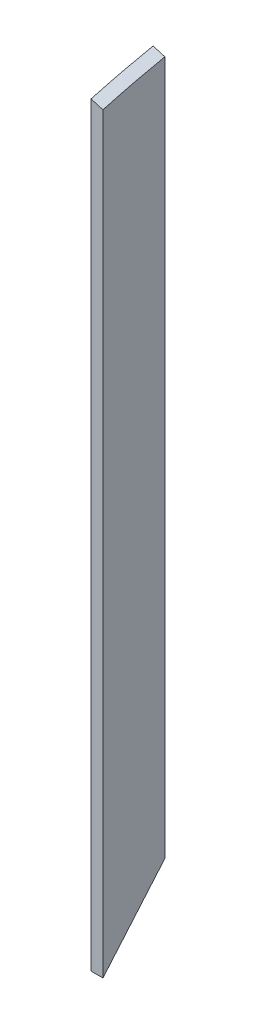
ISO-10303-21;
HEADER;
FILE_DESCRIPTION(('STEP AP214'),'2;1');
FILE_NAME('part.step','',(''),(''),'','','');
FILE_SCHEMA(('AUTOMOTIVE_DESIGN { 1 0 10303 214 1 1 1 1 }'));
ENDSEC;
DATA;
#1=APPLICATION_CONTEXT('core data for automotive mechanical design processes');
#2=APPLICATION_PROTOCOL_DEFINITION('international standard','automotive_design',2000,#1);
#3=PRODUCT_CONTEXT('',#1,'mechanical');
#4=PRODUCT('Part','Part','',(#3));
#5=PRODUCT_RELATED_PRODUCT_CATEGORY('part','',(#4));
#6=PRODUCT_DEFINITION_FORMATION('','',#4);
#7=PRODUCT_DEFINITION_CONTEXT('part definition',#1,'design');
#8=PRODUCT_DEFINITION('design','',#6,#7);
#9=PRODUCT_DEFINITION_SHAPE('','',#8);
#10=(LENGTH_UNIT() NAMED_UNIT(*) SI_UNIT(.MILLI.,.METRE.));
#11=(NAMED_UNIT(*) PLANE_ANGLE_UNIT() SI_UNIT($,.RADIAN.));
#12=(NAMED_UNIT(*) SI_UNIT($,.STERADIAN.) SOLID_ANGLE_UNIT());
#13=UNCERTAINTY_MEASURE_WITH_UNIT(LENGTH_MEASURE(1.E-05),#10,'distance_accuracy_value','');
#14=(GEOMETRIC_REPRESENTATION_CONTEXT(3) GLOBAL_UNCERTAINTY_ASSIGNED_CONTEXT((#13)) GLOBAL_UNIT_ASSIGNED_CONTEXT((#10,
#11,#12)) REPRESENTATION_CONTEXT('',''));
#15=CARTESIAN_POINT('',(0.,0.,0.));
#16=DIRECTION('',(0.,0.,1.));
#17=DIRECTION('',(1.,0.,0.));
#18=AXIS2_PLACEMENT_3D('',#15,#16,#17);
#19=CARTESIAN_POINT('',(114.922721068152,110.654023481096,18.6636491961611));
#20=CARTESIAN_POINT('',(114.919502655417,111.325435038433,17.5793740563256));
#21=CARTESIAN_POINT('',(114.912647130221,112.567930828725,15.3820902940956));
#22=CARTESIAN_POINT('',(114.904072156595,114.114718488642,12.0907167514568));
#23=CARTESIAN_POINT('',(114.899760858364,115.315705283254,8.88422166455286));
#24=CARTESIAN_POINT('',(114.904772036529,116.456706466605,4.80386427139214));
#25=CARTESIAN_POINT('',(114.926037269445,116.823900728959,2.05006306522136));
#26=CARTESIAN_POINT('',(114.953225925957,116.94235421813,0.414110401426249));
#27=CARTESIAN_POINT('',(115.225751413496,110.653984163291,18.6634138121703));
#28=CARTESIAN_POINT('',(115.220652416992,111.325381616022,17.5792154912705));
#29=CARTESIAN_POINT('',(115.209982821501,112.567294272047,15.3814728773825));
#30=CARTESIAN_POINT('',(115.196247760789,114.112844238994,12.0890485996327));
#31=CARTESIAN_POINT('',(115.187991312897,115.313584239619,8.88245363851667));
#32=CARTESIAN_POINT('',(115.190142555533,116.455227024998,4.80273283147372));
#33=CARTESIAN_POINT('',(115.212609250824,116.823594241705,2.04980144404081));
#34=CARTESIAN_POINT('',(115.242264990126,116.942356031957,0.414110002792164));
#35=CARTESIAN_POINT('',(115.830653981397,110.649256729008,18.6581194765323));
#36=CARTESIAN_POINT('',(115.821959141385,111.320352813837,17.5742278072858));
#37=CARTESIAN_POINT('',(115.803847585746,112.560636953868,15.3760282542018));
#38=CARTESIAN_POINT('',(115.779895440134,114.103291557525,12.082431180946));
#39=CARTESIAN_POINT('',(115.763901015008,115.3034725391,8.87674677885018));
#40=CARTESIAN_POINT('',(115.760555841199,116.446568591924,4.79967553848202));
#41=CARTESIAN_POINT('',(115.785576167897,116.817345786532,2.04905422532069));
#42=CARTESIAN_POINT('',(115.820245156084,116.936837401941,0.414204277524026));
#43=CARTESIAN_POINT('',(116.743568346008,110.6278778152,18.6353544123418));
#44=CARTESIAN_POINT('',(116.729216498517,111.298061200236,17.552814435961));
#45=CARTESIAN_POINT('',(116.699189353104,112.535138488739,15.3560085805786));
#46=CARTESIAN_POINT('',(116.658561840845,114.072628950438,12.0638101938352));
#47=CARTESIAN_POINT('',(116.629769639079,115.271433004687,8.86236896257952));
#48=CARTESIAN_POINT('',(116.616660148035,116.416440380312,4.79260122883147));
#49=CARTESIAN_POINT('',(116.644306390072,116.791097390367,2.04725432012016));
#50=CARTESIAN_POINT('',(116.68557075427,116.912060694288,0.414635967144779));
#51=CARTESIAN_POINT('',(117.64285119449,110.592697363985,18.598310150078));
#52=CARTESIAN_POINT('',(117.6237655248,111.261497340516,17.5179946805126));
#53=CARTESIAN_POINT('',(117.583398077587,112.494651292746,15.3246845377376));
#54=CARTESIAN_POINT('',(117.528037146246,114.02623472504,12.0370721826068));
#55=CARTESIAN_POINT('',(117.488319270492,115.222990073713,8.84256433934267));
#56=CARTESIAN_POINT('',(117.467751468814,116.369357429443,4.78312737107974));
#57=CARTESIAN_POINT('',(117.499480110829,116.748085006081,2.04481543128824));
#58=CARTESIAN_POINT('',(117.548159368522,116.870844837522,0.415362960436575));
#59=CARTESIAN_POINT('',(118.543973933552,110.543225730251,18.5465120004037));
#60=CARTESIAN_POINT('',(118.519982844402,111.210131388518,17.4692554100843));
#61=CARTESIAN_POINT('',(118.468790059746,112.438634923086,15.2815347570807));
#62=CARTESIAN_POINT('',(118.397804830218,113.963676404405,12.0018123209999));
#63=CARTESIAN_POINT('',(118.346318520619,115.157860641402,8.8170739975301));
#64=CARTESIAN_POINT('',(118.317089160155,116.305238089574,4.77117184766666));
#65=CARTESIAN_POINT('',(118.35177160135,116.688306528184,2.04170914360372));
#66=CARTESIAN_POINT('',(118.406902120137,116.813236407478,0.416390371403476));
#67=CARTESIAN_POINT('',(119.44277615242,110.479173108781,18.4797269812068));
#68=CARTESIAN_POINT('',(119.41389639041,111.143711367014,17.4064137879403));
#69=CARTESIAN_POINT('',(119.351802639073,112.366878720667,15.2264071592544));
#70=CARTESIAN_POINT('',(119.264928970987,113.884772769934,11.9578810194055));
#71=CARTESIAN_POINT('',(119.201401398495,115.075923838074,8.78578681757699));
#72=CARTESIAN_POINT('',(119.162971368509,116.22405272723,4.75668885008777));
#73=CARTESIAN_POINT('',(119.19985968635,116.61177512989,2.0379208629042));
#74=CARTESIAN_POINT('',(119.260692638214,116.739272936473,0.417723133967515));
#75=CARTESIAN_POINT('',(120.326205378249,110.401554350642,18.3990921743292));
#76=CARTESIAN_POINT('',(120.293179803749,111.063191100802,17.3305352223659));
#77=CARTESIAN_POINT('',(120.221603723504,112.280219057438,15.1601850803052));
#78=CARTESIAN_POINT('',(120.120790535692,113.790201982083,11.9059182726791));
#79=CARTESIAN_POINT('',(120.047016974189,114.977706813779,8.74913707393806));
#80=CARTESIAN_POINT('',(120.001420922015,116.126119280415,4.73988285825633));
#81=CARTESIAN_POINT('',(120.041522898656,116.518631654667,2.03352437892435));
#82=CARTESIAN_POINT('',(120.108453620281,116.648977366015,0.419366863196329));
#83=CARTESIAN_POINT('',(121.207772981753,110.309521585924,18.3038087322582));
#84=CARTESIAN_POINT('',(121.17039960314,110.967797942276,17.2409225707271));
#85=CARTESIAN_POINT('',(121.088965915609,112.178003361507,15.0823020141401));
#86=CARTESIAN_POINT('',(120.973670428435,113.679453073722,11.8454913591045));
#87=CARTESIAN_POINT('',(120.889055659749,114.862841162806,8.70681703054935));
#88=CARTESIAN_POINT('',(120.835231171218,116.011254383707,4.72060061542824));
#89=CARTESIAN_POINT('',(120.87726481726,116.408820577333,2.02846659520302));
#90=CARTESIAN_POINT('',(120.949114647416,116.542371603069,0.421324777720173));
#91=CARTESIAN_POINT('',(122.07894086088,110.204028625176,18.1949688212601));
#92=CARTESIAN_POINT('',(122.037481832258,110.858443061155,17.1386204037375));
#93=CARTESIAN_POINT('',(121.946766431347,112.061040963344,14.9936401230406));
#94=CARTESIAN_POINT('',(121.81784552706,113.553171521489,11.7772381165898));
#95=CARTESIAN_POINT('',(121.723096109869,114.731815141033,8.65925610237083));
#96=CARTESIAN_POINT('',(121.661589325732,115.879729907726,4.6990419832429));
#97=CARTESIAN_POINT('',(121.705354058666,116.282436005261,2.02282379148673));
#98=CARTESIAN_POINT('',(121.781643784019,116.419430530347,0.423609119845726));
#99=CARTESIAN_POINT('',(122.940043421039,110.085535649444,18.073151263622));
#100=CARTESIAN_POINT('',(122.894664787672,110.73558637962,17.0242019606626));
#101=CARTESIAN_POINT('',(122.795087582583,111.929768012383,14.8946796133261));
#102=CARTESIAN_POINT('',(122.6532079116,113.411738153575,11.7014913192463));
#103=CARTESIAN_POINT('',(122.548826854435,114.584956276931,8.60666228611148));
#104=CARTESIAN_POINT('',(122.479883405771,115.73179062176,4.67528323486592));
#105=CARTESIAN_POINT('',(122.524907622142,116.139638653058,2.0166065359517));
#106=CARTESIAN_POINT('',(122.604953229161,116.280253549222,0.426198551981068));
#107=CARTESIAN_POINT('',(123.789706686758,109.954626157281,17.9390734815831));
#108=CARTESIAN_POINT('',(123.740614593405,110.599833140044,16.8983334521208));
#109=CARTESIAN_POINT('',(123.632710264196,111.78483693672,14.7859398762785));
#110=CARTESIAN_POINT('',(123.478740856593,113.255888739361,11.6185989634062));
#111=CARTESIAN_POINT('',(123.365402362585,114.4230639463,8.54922835909024));
#112=CARTESIAN_POINT('',(123.289456034808,115.568280158633,4.64934556249179));
#113=CARTESIAN_POINT('',(123.335366918755,115.981252728008,2.00974679959702));
#114=CARTESIAN_POINT('',(123.418540332784,116.125636003205,0.428982253767693));
#115=CARTESIAN_POINT('',(124.629644510649,109.811207491047,17.7927837938395));
#116=CARTESIAN_POINT('',(124.576882455315,110.451109501508,16.7610853961534));
#117=CARTESIAN_POINT('',(124.46089012816,111.626199009023,14.6674831804084));
#118=CARTESIAN_POINT('',(124.295294900925,113.085606634865,11.5286154492367));
#119=CARTESIAN_POINT('',(124.173260685051,114.246151328209,8.48700170732796));
#120=CARTESIAN_POINT('',(124.090179671904,115.389240272858,4.62127902298393));
#121=CARTESIAN_POINT('',(124.136153876362,115.807322999511,2.00230583878759));
#122=CARTESIAN_POINT('',(124.221511623704,115.955617266535,0.432029577240527));
#123=CARTESIAN_POINT('',(125.455109245557,109.656464589371,17.6356378059314));
#124=CARTESIAN_POINT('',(125.398971548514,110.29055773091,16.6137285530749));
#125=CARTESIAN_POINT('',(125.275636012858,111.454897129007,14.540374746647));
#126=CARTESIAN_POINT('',(125.099613095932,112.901778019777,11.4323195303875));
#127=CARTESIAN_POINT('',(124.969829513425,114.054950922445,8.42051300984939));
#128=CARTESIAN_POINT('',(124.880340425408,115.195184831965,4.59134047533096));
#129=CARTESIAN_POINT('',(124.926153789198,115.618172010654,1.99439020712139));
#130=CARTESIAN_POINT('',(125.013151787918,115.770387109237,0.435368799819775));
#131=CARTESIAN_POINT('',(126.269619822428,109.489981588804,17.467375066845));
#132=CARTESIAN_POINT('',(126.210143498767,110.117808667357,16.4560290313831));
#133=CARTESIAN_POINT('',(126.07971324473,111.270644566807,14.4044187744586));
#134=CARTESIAN_POINT('',(125.893746898328,112.704227142795,11.3295645242465));
#135=CARTESIAN_POINT('',(125.756453027758,113.849390193196,8.34966011767521));
#136=CARTESIAN_POINT('',(125.660346211041,114.986162058646,4.55949051009256));
#137=CARTESIAN_POINT('',(125.705072662837,115.413914969673,1.98600946816327));
#138=CARTESIAN_POINT('',(125.792693092461,115.57009419741,0.439038937026957));
#139=CARTESIAN_POINT('',(127.068621906014,109.31308181563,17.2894917224386));
#140=CARTESIAN_POINT('',(127.006086317256,109.934128723429,16.2893687572323));
#141=CARTESIAN_POINT('',(126.869285367868,111.074587378596,14.2607813375011));
#142=CARTESIAN_POINT('',(126.674536683175,112.493912839182,11.2212044004219));
#143=CARTESIAN_POINT('',(126.530609335982,113.63024479076,8.27502981555207));
#144=CARTESIAN_POINT('',(126.428489822561,114.762690020968,4.52601784198696));
#145=CARTESIAN_POINT('',(126.471794152142,115.194849546568,1.9772870466317));
#146=CARTESIAN_POINT('',(126.559423084959,115.354884375843,0.443076896012916));
#147=CARTESIAN_POINT('',(127.859412297571,109.124328402743,17.1007162929509));
#148=CARTESIAN_POINT('',(127.793624032428,109.738181953476,16.1125580600829));
#149=CARTESIAN_POINT('',(127.650249824231,110.865591212205,14.1084662172202));
#150=CARTESIAN_POINT('',(127.446529884804,112.269991229348,11.1064984895475));
#151=CARTESIAN_POINT('',(127.295515906758,113.396945458431,8.1961104614033));
#152=CARTESIAN_POINT('',(127.186240293364,114.524543402038,4.49068470864533));
#153=CARTESIAN_POINT('',(127.226494231787,114.960983196968,1.96815981345401));
#154=CARTESIAN_POINT('',(127.312653737525,115.124904535825,0.447517744950626));
#155=CARTESIAN_POINT('',(128.634553295224,108.925589635486,16.9030875264351));
#156=CARTESIAN_POINT('',(128.565738665707,109.53174161876,15.9274657964116));
#157=CARTESIAN_POINT('',(128.416403496808,110.645241419426,13.949062530336));
#158=CARTESIAN_POINT('',(128.204680392061,112.033759241662,10.9866086102302));
#159=CARTESIAN_POINT('',(128.047232738218,113.150510845407,8.11370467123515));
#160=CARTESIAN_POINT('',(127.931091637767,114.272358629483,4.45388700044103));
#161=CARTESIAN_POINT('',(127.967729515364,114.712637972987,1.95879401405366));
#162=CARTESIAN_POINT('',(128.051672451863,114.88026417015,0.452406294406413));
#163=CARTESIAN_POINT('',(129.395500326068,108.716864068897,16.69674578504));
#164=CARTESIAN_POINT('',(129.323772889153,109.314817363053,15.7341871277748));
#165=CARTESIAN_POINT('',(129.168862270846,110.413589745668,13.7826606225426));
#166=CARTESIAN_POINT('',(128.949762059408,111.78533555205,10.861587728903));
#167=CARTESIAN_POINT('',(128.786190174837,112.891115691681,8.02784302100585));
#168=CARTESIAN_POINT('',(128.663028823268,114.006360554095,4.41563203273844));
#169=CARTESIAN_POINT('',(128.695176315306,114.450045878421,1.94919504594197));
#170=CARTESIAN_POINT('',(128.775965568022,114.621188055638,0.45775054528022));
#171=CARTESIAN_POINT('',(130.146418017836,108.496878025111,16.4806015524361));
#172=CARTESIAN_POINT('',(130.071589339048,109.086169498983,15.5317305234433));
#173=CARTESIAN_POINT('',(129.910862214388,110.169455592139,13.6085284459086));
#174=CARTESIAN_POINT('',(129.684037119934,111.523589342433,10.7309553591927));
#175=CARTESIAN_POINT('',(129.513672147651,112.61769497608,7.93829403478979));
#176=CARTESIAN_POINT('',(129.382031291954,113.725586602181,4.37598493730472));
#177=CARTESIAN_POINT('',(129.407838780257,114.17233520483,1.93961524440706));
#178=CARTESIAN_POINT('',(129.48388934463,114.346862284779,0.463903392110953));
#179=CARTESIAN_POINT('',(130.878555666009,108.268264902668,16.2573841288218));
#180=CARTESIAN_POINT('',(130.80091485168,108.848293920759,15.3226103583183));
#181=CARTESIAN_POINT('',(130.635038825038,109.915053592941,13.4288008486226));
#182=CARTESIAN_POINT('',(130.401425079221,111.250286988662,10.5962462090754));
#183=CARTESIAN_POINT('',(130.224860233428,112.331581533145,7.84608733516594));
#184=CARTESIAN_POINT('',(130.084964686778,113.430782620677,4.3353978346907));
#185=CARTESIAN_POINT('',(130.103880744547,113.879786055035,1.93017779238235));
#186=CARTESIAN_POINT('',(130.174510468417,114.057256445411,0.470813887746122));
#187=CARTESIAN_POINT('',(131.598444293574,108.028978937581,16.0252342983254));
#188=CARTESIAN_POINT('',(131.517860095798,108.599268475534,15.1051183191854));
#189=CARTESIAN_POINT('',(131.346654440296,109.648699559826,13.242032887492));
#190=CARTESIAN_POINT('',(131.105907961372,110.964086553318,10.4563830330197));
#191=CARTESIAN_POINT('',(130.922459503349,112.031760034745,7.7504742075413));
#192=CARTESIAN_POINT('',(130.772847270869,113.121349597723,4.2935177212104));
#193=CARTESIAN_POINT('',(130.783080220504,113.572090159283,1.92078115936628));
#194=CARTESIAN_POINT('',(130.846792951935,113.752239977936,0.478522930952146));
#195=CARTESIAN_POINT('',(132.297517433767,107.78195985391,15.7871163303848));
#196=CARTESIAN_POINT('',(132.214307681907,108.341873083794,14.8820039005234));
#197=CARTESIAN_POINT('',(132.0384532925,109.372846058504,13.0505050034375));
#198=CARTESIAN_POINT('',(131.791472382426,110.666952098898,10.3130038236447));
#199=CARTESIAN_POINT('',(131.601702133249,111.719714949332,7.65253112871263));
#200=CARTESIAN_POINT('',(131.442604035632,112.798120028442,4.25077749976452));
#201=CARTESIAN_POINT('',(131.44369623677,113.249559637443,1.91148379624603));
#202=CARTESIAN_POINT('',(131.499930327777,113.431778178463,0.486890881723489));
#203=CARTESIAN_POINT('',(132.99059276561,107.521546993657,15.5377178258851));
#204=CARTESIAN_POINT('',(132.904140286646,108.070725493788,14.648425253996));
#205=CARTESIAN_POINT('',(132.722475857373,109.082683689149,12.8502353416741));
#206=CARTESIAN_POINT('',(132.467418363881,110.35497021664,10.1633827458578));
#207=CARTESIAN_POINT('',(132.26911409651,111.392402300535,7.55063141890503));
#208=CARTESIAN_POINT('',(132.097027338088,112.459199891425,4.20683753377783));
#209=CARTESIAN_POINT('',(132.085688240065,112.911166006078,1.90271885477966));
#210=CARTESIAN_POINT('',(132.131984392193,113.095394892329,0.496768522191731));
#211=CARTESIAN_POINT('',(133.662046624192,107.25314180938,15.2823595673198));
#212=CARTESIAN_POINT('',(133.57257418488,107.790975732426,14.409304079964));
#213=CARTESIAN_POINT('',(133.385544330352,108.78281066769,12.6452515208837));
#214=CARTESIAN_POINT('',(133.122891288391,110.031867375892,10.0102906093209));
#215=CARTESIAN_POINT('',(132.916199484356,111.052695791702,7.44645244670917));
#216=CARTESIAN_POINT('',(132.730842104893,112.106308251516,4.16212482902499));
#217=CARTESIAN_POINT('',(132.706311499867,112.557710013587,1.89418570950117));
#218=CARTESIAN_POINT('',(132.741965265209,112.743283690859,0.507473060023241));
#219=CARTESIAN_POINT('',(134.321274964512,106.972704046047,15.0173361468944));
#220=CARTESIAN_POINT('',(134.228504604416,107.49876699236,14.1611258351854));
#221=CARTESIAN_POINT('',(134.03557646125,108.469764553328,12.4324547567377));
#222=CARTESIAN_POINT('',(133.764375050526,109.694792744114,9.85124733693011));
#223=CARTESIAN_POINT('',(133.548000944943,110.698317824676,7.33807081248547));
#224=CARTESIAN_POINT('',(133.347174672583,111.737891077402,4.11538387190067));
#225=CARTESIAN_POINT('',(133.307272727119,112.188143946194,1.88505747882715));
#226=CARTESIAN_POINT('',(133.330648943629,112.374715590632,0.518429568312062));
#227=CARTESIAN_POINT('',(134.964529929712,106.680786484559,14.743363131104));
#228=CARTESIAN_POINT('',(134.868080078999,107.194781919786,13.9044695794637));
#229=CARTESIAN_POINT('',(134.668511576225,108.144506169287,12.2121798341504));
#230=CARTESIAN_POINT('',(134.387501672075,109.345128909118,9.68629181327502));
#231=CARTESIAN_POINT('',(134.159856116883,110.3310213849,7.22527061168337));
#232=CARTESIAN_POINT('',(133.94100944408,111.356108457206,4.06611513957652));
#233=CARTESIAN_POINT('',(133.883355067624,111.804822533084,1.8746870892069));
#234=CARTESIAN_POINT('',(133.892730401772,111.992138058777,0.528927294128911));
#235=CARTESIAN_POINT('',(135.590321155591,106.377513073349,14.4607214171458));
#236=CARTESIAN_POINT('',(135.490414422165,106.878883376637,13.6395555598158));
#237=CARTESIAN_POINT('',(135.284721478636,107.806388209148,11.9845248767602));
#238=CARTESIAN_POINT('',(134.994625855159,108.981499239338,9.51535786051882));
#239=CARTESIAN_POINT('',(134.756133983435,109.948739202618,7.10785867718509));
#240=CARTESIAN_POINT('',(134.519452944097,110.958019268447,4.01399448351732));
#241=CARTESIAN_POINT('',(134.443784305364,111.404198773331,1.8626862622144));
#242=CARTESIAN_POINT('',(134.438883319494,111.591630129016,0.538553147784656));
#243=CARTESIAN_POINT('',(136.201072869893,106.062113799319,14.1688506796861));
#244=CARTESIAN_POINT('',(136.097408224996,106.550843556961,13.3658187733114));
#245=CARTESIAN_POINT('',(135.885126134239,107.456281551119,11.7489417215514));
#246=CARTESIAN_POINT('',(135.585303349923,108.606392780779,9.33796006776094));
#247=CARTESIAN_POINT('',(135.335030695136,109.555469126973,6.98540856481879));
#248=CARTESIAN_POINT('',(135.07891411571,110.54946518067,3.95867125584219));
#249=CARTESIAN_POINT('',(134.983674844251,110.993285325136,1.84876124028406));
#250=CARTESIAN_POINT('',(134.963402824076,111.180890372069,0.547054066784876));
#251=CARTESIAN_POINT('',(136.795981566049,105.735727006808,13.8689526670047));
#252=CARTESIAN_POINT('',(136.68853113301,106.211533482772,13.0843247727708));
#253=CARTESIAN_POINT('',(136.469832698208,107.094608045909,11.5062838853481));
#254=CARTESIAN_POINT('',(136.160752064342,108.219686058577,9.15473024578717));
#255=CARTESIAN_POINT('',(135.898894652042,109.150544683357,6.85834309117793));
#256=CARTESIAN_POINT('',(135.62328770021,110.129066698476,3.90031417379758));
#257=CARTESIAN_POINT('',(135.508134889934,110.570192163268,1.83292787725972));
#258=CARTESIAN_POINT('',(135.472232682135,110.757707715894,0.554365910631871));
#259=CARTESIAN_POINT('',(137.376475709813,105.398879283185,13.5616349357755));
#260=CARTESIAN_POINT('',(137.265240106046,105.861805765407,12.7957024504186));
#261=CARTESIAN_POINT('',(137.040219524481,106.722731056377,11.2571027036347));
#262=CARTESIAN_POINT('',(136.722092368611,107.823303023776,8.96596673455842));
#263=CARTESIAN_POINT('',(136.448695650222,108.736464185495,6.72678437563267));
#264=CARTESIAN_POINT('',(136.153445698335,109.700055825692,3.83887494245544));
#265=CARTESIAN_POINT('',(136.018032325504,110.13860686143,1.81504430978161));
#266=CARTESIAN_POINT('',(135.966268879561,110.326030683682,0.560301701386338));
#267=CARTESIAN_POINT('',(137.943492189676,105.052325452275,13.2477022615364));
#268=CARTESIAN_POINT('',(137.828042511068,105.501823303219,12.5004495255258));
#269=CARTESIAN_POINT('',(137.596443561441,106.340085979492,11.001640680566));
#270=CARTESIAN_POINT('',(137.26964289331,107.416206620909,8.77199121845407));
#271=CARTESIAN_POINT('',(136.984749971993,108.311585582963,6.59100449215521));
#272=CARTESIAN_POINT('',(136.669589487168,109.259901846825,3.77447868314897));
#273=CARTESIAN_POINT('',(136.513468779642,109.695354553877,1.79513201510913));
#274=CARTESIAN_POINT('',(136.445560522693,109.88228306411,0.564827985468215));
#275=CARTESIAN_POINT('',(138.497590620821,104.697360877596,12.9284286147097));
#276=CARTESIAN_POINT('',(138.379010360602,105.134005483409,12.200125369544));
#277=CARTESIAN_POINT('',(138.142904614327,105.950669793942,10.7414867252566));
#278=CARTESIAN_POINT('',(137.810469074269,107.003819906137,8.57376973887872));
#279=CARTESIAN_POINT('',(137.517197643077,107.882892771808,6.45159691430676));
#280=CARTESIAN_POINT('',(137.186320515775,108.817694367707,3.70741512481369));
#281=CARTESIAN_POINT('',(137.012598876399,109.250946365833,1.77332474446836));
#282=CARTESIAN_POINT('',(136.930669122604,109.437827144585,0.56799289009607));
#283=CARTESIAN_POINT('',(139.038106789727,104.336408165097,12.6060470013651));
#284=CARTESIAN_POINT('',(138.913144530265,104.758522182388,11.8966042903692));
#285=CARTESIAN_POINT('',(138.666349023497,105.5506881697,10.478132745835));
#286=CARTESIAN_POINT('',(138.319323002811,106.577262636271,8.37264422902514));
#287=CARTESIAN_POINT('',(138.008341005593,107.436534226044,6.30962530683556));
#288=CARTESIAN_POINT('',(137.648916527838,108.353218148826,3.63831100026925));
#289=CARTESIAN_POINT('',(137.447643875401,108.780826833156,1.74995111045068));
#290=CARTESIAN_POINT('',(137.345080406902,108.965447148644,0.569963574176255));
#291=CARTESIAN_POINT('',(139.395038614064,104.089198865665,12.3868019168595));
#292=CARTESIAN_POINT('',(139.271248113416,104.502773469585,11.6881885657459));
#293=CARTESIAN_POINT('',(139.032285356481,105.284147764207,10.2956751941966));
#294=CARTESIAN_POINT('',(138.703896442351,106.305375571814,8.23395625720348));
#295=CARTESIAN_POINT('',(138.408800985779,107.162113525745,6.2117846000377));
#296=CARTESIAN_POINT('',(138.06685424745,108.079117653681,3.5902483713719));
#297=CARTESIAN_POINT('',(137.874673961694,108.510771981469,1.7330387547634));
#298=CARTESIAN_POINT('',(137.776795429263,108.698572758265,0.570370654680235));
#299=CARTESIAN_POINT('',(139.571670484226,103.964903039145,12.2769599484237));
#300=CARTESIAN_POINT('',(139.443778795275,104.373667783412,11.5858850803895));
#301=CARTESIAN_POINT('',(139.19490237974,105.14503711497,10.2075713864124));
#302=CARTESIAN_POINT('',(138.848809312042,106.152275143037,8.16569050873052));
#303=CARTESIAN_POINT('',(138.535567082904,106.998283649001,6.16305250764429));
#304=CARTESIAN_POINT('',(138.168152387982,107.904577385449,3.56608958023977));
#305=CARTESIAN_POINT('',(137.954760674036,108.331207402007,1.72446307812241));
#306=CARTESIAN_POINT('',(137.841972434764,108.516293145386,0.570498319945944));
#307=(BOUNDED_SURFACE() B_SPLINE_SURFACE(3,3,((#19,#20,#21,#22,#23,#24,#25,#26),(#27,#28,#29,
#30,#31,#32,#33,#34),(#35,#36,#37,#38,#39,#40,#41,#42),(#43,#44,#45,#46,#47,#48,#49,#50),(#51,
#52,#53,#54,#55,#56,#57,#58),(#59,#60,#61,#62,#63,#64,#65,#66),(#67,#68,#69,#70,#71,#72,#73,
#74),(#75,#76,#77,#78,#79,#80,#81,#82),(#83,#84,#85,#86,#87,#88,#89,#90),(#91,#92,#93,#94,#95,
#96,#97,#98),(#99,#100,#101,#102,#103,#104,#105,#106),(#107,#108,#109,#110,#111,#112,#113,#114),
(#115,#116,#117,#118,#119,#120,#121,#122),(#123,#124,#125,#126,#127,#128,#129,#130),(#131,#132,
#133,#134,#135,#136,#137,#138),(#139,#140,#141,#142,#143,#144,#145,#146),(#147,#148,#149,#150,
#151,#152,#153,#154),(#155,#156,#157,#158,#159,#160,#161,#162),(#163,#164,#165,#166,#167,#168,
#169,#170),(#171,#172,#173,#174,#175,#176,#177,#178),(#179,#180,#181,#182,#183,#184,#185,#186),
(#187,#188,#189,#190,#191,#192,#193,#194),(#195,#196,#197,#198,#199,#200,#201,#202),(#203,#204,
#205,#206,#207,#208,#209,#210),(#211,#212,#213,#214,#215,#216,#217,#218),(#219,#220,#221,#222,
#223,#224,#225,#226),(#227,#228,#229,#230,#231,#232,#233,#234),(#235,#236,#237,#238,#239,#240,
#241,#242),(#243,#244,#245,#246,#247,#248,#249,#250),(#251,#252,#253,#254,#255,#256,#257,#258),
(#259,#260,#261,#262,#263,#264,#265,#266),(#267,#268,#269,#270,#271,#272,#273,#274),(#275,#276,
#277,#278,#279,#280,#281,#282),(#283,#284,#285,#286,#287,#288,#289,#290),(#291,#292,#293,#294,
#295,#296,#297,#298),(#299,#300,#301,#302,#303,#304,#305,#306)),.UNSPECIFIED.,.F.,.F.,
.F.) B_SPLINE_SURFACE_WITH_KNOTS((4,1,1,1,1,1,1,1,1,1,1,1,1,1,1,1,1,1,1,1,1,1,1,1,1,1,1,1,1,1,1,
1,1,4),(4,1,1,1,1,4),(0.,0.891757915098714,1.78351583019743,2.67527374529614,3.56703166039486,
4.45878957549357,5.35054749059228,6.242305405691,7.13406332078971,8.02582123588842,
8.91757915098714,9.80933706608585,10.7010949811846,11.5928528962833,12.484610811382,
13.3763687264807,14.2681266415794,15.1598845566781,16.0516424717768,16.9434003868756,
17.8351583019743,18.726916217073,19.6186741321717,20.5104320472704,21.4021899623691,
22.2939478774678,23.1857057925666,24.0774637076653,24.969221622764,25.8609795378627,
26.7527374529614,27.6444953680601,28.5362532831588,29.4280111982576),(0.,4.13874153545401,
8.27748307090802,12.416224606362,16.554966141816,24.8324492127241),
.UNSPECIFIED.) GEOMETRIC_REPRESENTATION_ITEM() RATIONAL_B_SPLINE_SURFACE(((1.,1.,1.,1.,1.,1.,1.,
1.),(1.,1.,1.,1.,1.,1.,1.,1.),(1.,1.,1.,1.,1.,1.,1.,1.),(1.,1.,1.,1.,1.,1.,1.,1.),(1.,1.,1.,1.,
1.,1.,1.,1.),(1.,1.,1.,1.,1.,1.,1.,1.),(1.,1.,1.,1.,1.,1.,1.,1.),(1.,1.,1.,1.,1.,1.,1.,1.),(1.,
1.,1.,1.,1.,1.,1.,1.),(1.,1.,1.,1.,1.,1.,1.,1.),(1.,1.,1.,1.,1.,1.,1.,1.),(1.,1.,1.,1.,1.,1.,1.,
1.),(1.,1.,1.,1.,1.,1.,1.,1.),(1.,1.,1.,1.,1.,1.,1.,1.),(1.,1.,1.,1.,1.,1.,1.,1.),(1.,1.,1.,1.,
1.,1.,1.,1.),(1.,1.,1.,1.,1.,1.,1.,1.),(1.,1.,1.,1.,1.,1.,1.,1.),(1.,1.,1.,1.,1.,1.,1.,1.),(1.,
1.,1.,1.,1.,1.,1.,1.),(1.,1.,1.,1.,1.,1.,1.,1.),(1.,1.,1.,1.,1.,1.,1.,1.),(1.,1.,1.,1.,1.,1.,1.,
1.),(1.,1.,1.,1.,1.,1.,1.,1.),(1.,1.,1.,1.,1.,1.,1.,1.),(1.,1.,1.,1.,1.,1.,1.,1.),(1.,1.,1.,1.,
1.,1.,1.,1.),(1.,1.,1.,1.,1.,1.,1.,1.),(1.,1.,1.,1.,1.,1.,1.,1.),(1.,1.,1.,1.,1.,1.,1.,1.),(1.,
1.,1.,1.,1.,1.,1.,1.),(1.,1.,1.,1.,1.,1.,1.,1.),(1.,1.,1.,1.,1.,1.,1.,1.),(1.,1.,1.,1.,1.,1.,1.,
1.),(1.,1.,1.,1.,1.,1.,1.,1.),(1.,1.,1.,1.,1.,1.,1.,1.))) REPRESENTATION_ITEM('') SURFACE());
#308=CARTESIAN_POINT('',(125.611863852919,115.110802996581,3.62988005976674));
#309=CARTESIAN_POINT('',(125.611863852919,115.019493831563,4.08337130174199));
#310=CARTESIAN_POINT('',(125.61186385292,114.920046122763,4.53523642503494));
#311=CARTESIAN_POINT('',(125.61186385292,114.704770499934,5.43631383116329));
#312=CARTESIAN_POINT('',(125.611863852919,114.589492138581,5.88290895854391));
#313=CARTESIAN_POINT('',(125.611863852919,114.46617489504,6.32878808187529));
#314=(BOUNDED_CURVE() B_SPLINE_CURVE(3,(#308,#309,#310,#311,#312,#313),.UNSPECIFIED.,.F.,
.F.) B_SPLINE_CURVE_WITH_KNOTS((4,2,4),(3.49082716644201E-06,0.138781191713383,
0.27793069226627),
.UNSPECIFIED.) CURVE() GEOMETRIC_REPRESENTATION_ITEM() RATIONAL_B_SPLINE_CURVE((1.,1.,1.,1.,1.,1.)) REPRESENTATION_ITEM(''));
#315=CARTESIAN_POINT('',(125.61186386872,115.110803081043,3.6298800767728));
#316=VERTEX_POINT('',#315);
#317=CARTESIAN_POINT('',(125.611863852411,114.466174895798,6.32878808208483));
#318=VERTEX_POINT('',#317);
#319=EDGE_CURVE('E11',#316,#318,#314,.T.);
#320=CARTESIAN_POINT('',(126.127860879701,114.311956977438,6.3287880825772));
#321=CARTESIAN_POINT('',(126.04204831854,114.338291879015,6.3287880825772));
#322=CARTESIAN_POINT('',(125.956146737212,114.364308406041,6.32878808257722));
#323=CARTESIAN_POINT('',(125.78413974721,114.415715574014,6.32878808257722));
#324=CARTESIAN_POINT('',(125.698051251657,114.441101155485,6.3287880825772));
#325=CARTESIAN_POINT('',(125.611863852195,114.466174895057,6.3287880825772));
#326=(BOUNDED_CURVE() B_SPLINE_CURVE(3,(#320,#321,#322,#323,#324,#325),.UNSPECIFIED.,.F.,
.F.) B_SPLINE_CURVE_WITH_KNOTS((4,2,4),(-0.0538607185942387,-0.0269324218887916,
-4.24961787248999E-06),
.UNSPECIFIED.) CURVE() GEOMETRIC_REPRESENTATION_ITEM() RATIONAL_B_SPLINE_CURVE((1.,1.,1.,1.,1.,1.)) REPRESENTATION_ITEM(''));
#327=CARTESIAN_POINT('',(126.127860879542,114.311956976921,6.3287880831552));
#328=VERTEX_POINT('',#327);
#329=EDGE_CURVE('E112',#328,#318,#326,.T.);
#330=CARTESIAN_POINT('',(126.127860879367,114.96229657424,3.62988105751597));
#331=CARTESIAN_POINT('',(126.127860879367,114.885780536831,4.00540282363609));
#332=CARTESIAN_POINT('',(126.127860880215,114.802300295275,4.38685630698534));
#333=CARTESIAN_POINT('',(126.127860877902,114.711262758537,4.77397751462359));
#334=CARTESIAN_POINT('',(126.127860876446,114.653937576579,5.01774282795452));
#335=CARTESIAN_POINT('',(126.127860879367,114.593615188585,5.26375619209077));
#336=CARTESIAN_POINT('',(126.127860879367,114.530139288717,5.51195842420251));
#337=CARTESIAN_POINT('',(126.127860879367,114.461117798405,5.78184491647611));
#338=CARTESIAN_POINT('',(126.127860879367,114.388407285967,6.05416451639483));
#339=CARTESIAN_POINT('',(126.127860879367,114.311956977347,6.32878808327362));
#340=(BOUNDED_CURVE() B_SPLINE_CURVE(3,(#330,#331,#332,#333,#334,#335,#336,#337,#338,#339),
.UNSPECIFIED.,.F.,.F.) B_SPLINE_CURVE_WITH_KNOTS((4,3,3,4),(0.,1.18516457193009,
1.93144766757289,2.77694599031573),
.UNSPECIFIED.) CURVE() GEOMETRIC_REPRESENTATION_ITEM() RATIONAL_B_SPLINE_CURVE((1.,1.,1.,1.,1.,
1.,1.,1.,1.,1.)) REPRESENTATION_ITEM(''));
#341=CARTESIAN_POINT('',(126.127860879367,114.96229657424,3.62988105751597));
#342=VERTEX_POINT('',#341);
#343=EDGE_CURVE('E83',#342,#328,#340,.T.);
#344=CARTESIAN_POINT('',(115.793748244352,80.0263586447145,3.59410504907934));
#345=DIRECTION('',(0.000275094440724614,0.000942672107953764,-0.999999517846057));
#346=DIRECTION('',(0.283652229971014,0.958926716771279,0.000981985094504115));
#347=AXIS2_PLACEMENT_3D('',#344,#345,#346);
#348=CIRCLE('',#347,36.4323334812859);
#349=EDGE_CURVE('E87',#316,#342,#348,.T.);
#350=ORIENTED_EDGE('',*,*,#319,.T.);
#351=ORIENTED_EDGE('',*,*,#329,.F.);
#352=ORIENTED_EDGE('',*,*,#343,.F.);
#353=ORIENTED_EDGE('',*,*,#349,.F.);
#354=EDGE_LOOP('',(#350,#351,#352,#353));
#355=FACE_BOUND('',#354,.T.);
#356=ADVANCED_FACE('F38',(#355),#307,.T.);
#357=CARTESIAN_POINT('',(125.611863852919,84.9285707009071,5.74883018807516));
#358=DIRECTION('',(-1.,0.,0.));
#359=DIRECTION('',(0.,0.,1.));
#360=AXIS2_PLACEMENT_3D('',#357,#358,#359);
#361=PLANE('',#360);
#362=DIRECTION('',(0.,-1.,0.));
#363=VECTOR('',#362,1.);
#364=CARTESIAN_POINT('',(125.611863852919,115.110824522008,3.62988105751597));
#365=LINE('',#364,#363);
#366=CARTESIAN_POINT('',(125.611863852919,84.7251227286355,3.62988105751595));
#367=VERTEX_POINT('',#366);
#368=EDGE_CURVE('E75',#316,#367,#365,.T.);
#369=ORIENTED_EDGE('',*,*,#368,.T.);
#370=DIRECTION('',(0.,0.76072482106239,-0.649074530866522));
#371=VECTOR('',#370,1.);
#372=CARTESIAN_POINT('',(125.611863852919,81.5619643145119,6.32878808257719));
#373=LINE('',#372,#371);
#374=CARTESIAN_POINT('',(125.611863852919,81.5619643145119,6.32878808257719));
#375=VERTEX_POINT('',#374);
#376=EDGE_CURVE('E91',#375,#367,#373,.T.);
#377=ORIENTED_EDGE('',*,*,#376,.F.);
#378=DIRECTION('',(0.,-1.,0.));
#379=VECTOR('',#378,1.);
#380=CARTESIAN_POINT('',(125.611863852919,114.466203567478,6.3287880825772));
#381=LINE('',#380,#379);
#382=EDGE_CURVE('E48',#318,#375,#381,.T.);
#383=ORIENTED_EDGE('',*,*,#382,.F.);
#384=ORIENTED_EDGE('',*,*,#319,.F.);
#385=EDGE_LOOP('',(#369,#377,#383,#384));
#386=FACE_BOUND('',#385,.T.);
#387=ADVANCED_FACE('F84',(#386),#361,.T.);
#388=CARTESIAN_POINT('',(126.191821747421,84.9285707009071,6.3287880825772));
#389=DIRECTION('',(0.,0.,1.));
#390=DIRECTION('',(1.,0.,0.));
#391=AXIS2_PLACEMENT_3D('',#388,#389,#390);
#392=PLANE('',#391);
#393=ORIENTED_EDGE('',*,*,#329,.T.);
#394=ORIENTED_EDGE('',*,*,#382,.T.);
#395=DIRECTION('',(-1.,0.,0.));
#396=VECTOR('',#395,1.);
#397=CARTESIAN_POINT('',(126.127860879367,81.5619643145119,6.32878808257719));
#398=LINE('',#397,#396);
#399=CARTESIAN_POINT('',(126.127860879367,81.5619643145119,6.32878808257719));
#400=VERTEX_POINT('',#399);
#401=EDGE_CURVE('E93',#400,#375,#398,.T.);
#402=ORIENTED_EDGE('',*,*,#401,.F.);
#403=DIRECTION('',(0.,-1.,0.));
#404=VECTOR('',#403,1.);
#405=CARTESIAN_POINT('',(126.127860879367,114.311956975365,6.3287880825772));
#406=LINE('',#405,#404);
#407=EDGE_CURVE('E111',#328,#400,#406,.T.);
#408=ORIENTED_EDGE('',*,*,#407,.F.);
#409=EDGE_LOOP('',(#393,#394,#402,#408));
#410=FACE_BOUND('',#409,.T.);
#411=ADVANCED_FACE('F40',(#410),#392,.T.);
#412=CARTESIAN_POINT('',(126.127860879367,84.9285707009071,5.74883018807516));
#413=DIRECTION('',(1.,0.,0.));
#414=DIRECTION('',(0.,1.,0.));
#415=AXIS2_PLACEMENT_3D('',#412,#413,#414);
#416=PLANE('',#415);
#417=ORIENTED_EDGE('',*,*,#343,.T.);
#418=ORIENTED_EDGE('',*,*,#407,.T.);
#419=DIRECTION('',(0.,-0.76072482106239,0.649074530866522));
#420=VECTOR('',#419,1.);
#421=CARTESIAN_POINT('',(126.127860879367,84.7251227286355,3.62988105751595));
#422=LINE('',#421,#420);
#423=CARTESIAN_POINT('',(126.127860879367,84.7251227286355,3.62988105751595));
#424=VERTEX_POINT('',#423);
#425=EDGE_CURVE('E100',#424,#400,#422,.T.);
#426=ORIENTED_EDGE('',*,*,#425,.F.);
#427=DIRECTION('',(0.,-1.,0.));
#428=VECTOR('',#427,1.);
#429=CARTESIAN_POINT('',(126.127860879367,114.96229657424,3.62988105751597));
#430=LINE('',#429,#428);
#431=EDGE_CURVE('E42',#342,#424,#430,.T.);
#432=ORIENTED_EDGE('',*,*,#431,.F.);
#433=EDGE_LOOP('',(#417,#418,#426,#432));
#434=FACE_BOUND('',#433,.T.);
#435=ADVANCED_FACE('F117',(#434),#416,.T.);
#436=CARTESIAN_POINT('',(126.191821747421,84.9285707009071,3.62988105751596));
#437=DIRECTION('',(0.,0.,-1.));
#438=DIRECTION('',(0.,-1.,0.));
#439=AXIS2_PLACEMENT_3D('',#436,#437,#438);
#440=PLANE('',#439);
#441=ORIENTED_EDGE('',*,*,#349,.T.);
#442=ORIENTED_EDGE('',*,*,#431,.T.);
#443=DIRECTION('',(1.,0.,0.));
#444=VECTOR('',#443,1.);
#445=CARTESIAN_POINT('',(125.611863852919,84.7251227286355,3.62988105751595));
#446=LINE('',#445,#444);
#447=EDGE_CURVE('E89',#367,#424,#446,.T.);
#448=ORIENTED_EDGE('',*,*,#447,.F.);
#449=ORIENTED_EDGE('',*,*,#368,.F.);
#450=EDGE_LOOP('',(#441,#442,#448,#449));
#451=FACE_BOUND('',#450,.T.);
#452=ADVANCED_FACE('F86',(#451),#440,.T.);
#453=CARTESIAN_POINT('',(125.869862366143,84.7251227286355,3.62988105751595));
#454=DIRECTION('',(0.,-0.649074530866522,-0.76072482106239));
#455=DIRECTION('',(0.,-0.76072482106239,0.649074530866522));
#456=AXIS2_PLACEMENT_3D('',#453,#454,#455);
#457=PLANE('',#456);
#458=ORIENTED_EDGE('',*,*,#447,.T.);
#459=ORIENTED_EDGE('',*,*,#425,.T.);
#460=ORIENTED_EDGE('',*,*,#401,.T.);
#461=ORIENTED_EDGE('',*,*,#376,.T.);
#462=EDGE_LOOP('',(#458,#459,#460,#461));
#463=FACE_BOUND('',#462,.T.);
#464=ADVANCED_FACE('F123',(#463),#457,.T.);
#465=CLOSED_SHELL('',(#356,#387,#411,#435,#452,#464));
#466=MANIFOLD_SOLID_BREP('B2',#465);
#467=ADVANCED_BREP_SHAPE_REPRESENTATION('',(#18,#466),#14);
#468=SHAPE_DEFINITION_REPRESENTATION(#9,#467);
ENDSEC;
END-ISO-10303-21;
